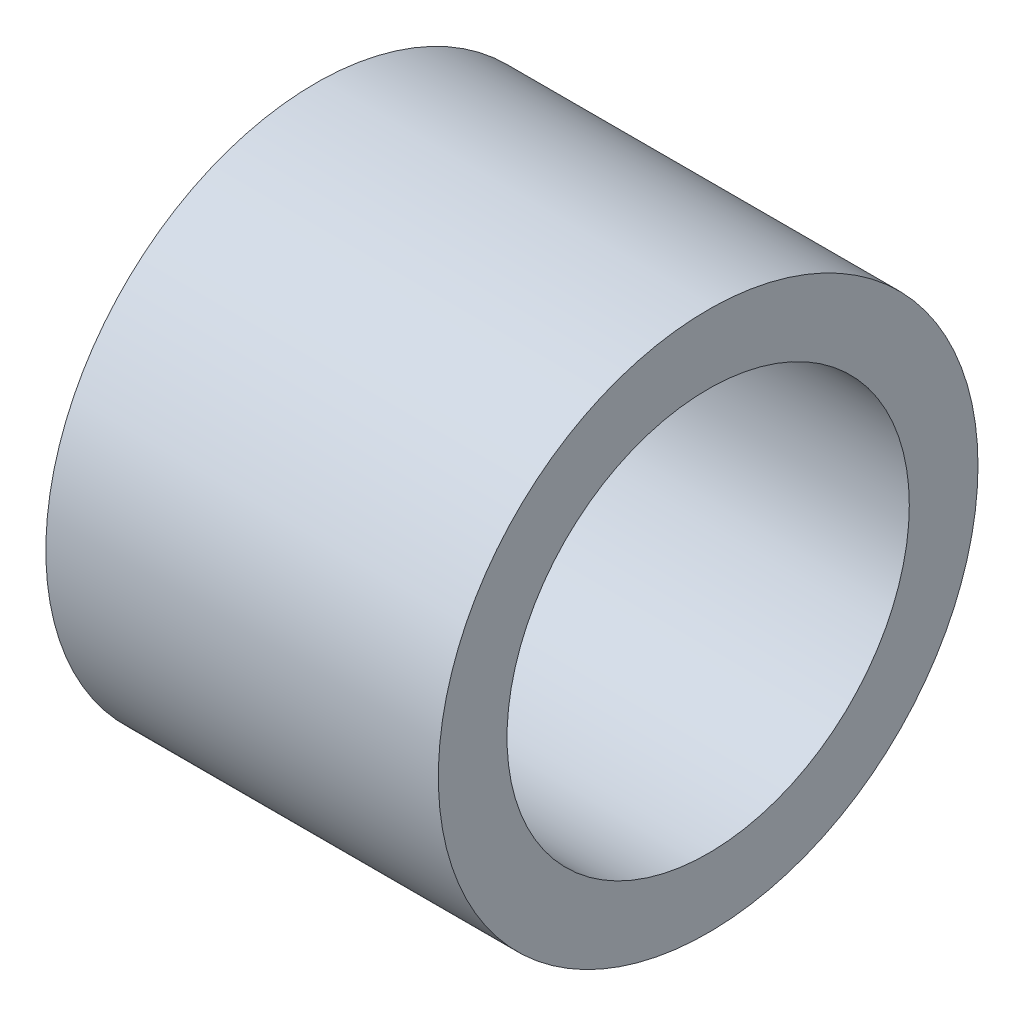
ISO-10303-21;
HEADER;
FILE_DESCRIPTION(('STEP AP214'),'2;1');
FILE_NAME('part.step','',(''),(''),'','','');
FILE_SCHEMA(('AUTOMOTIVE_DESIGN { 1 0 10303 214 1 1 1 1 }'));
ENDSEC;
DATA;
#1=APPLICATION_CONTEXT('core data for automotive mechanical design processes');
#2=APPLICATION_PROTOCOL_DEFINITION('international standard','automotive_design',2000,#1);
#3=PRODUCT_CONTEXT('',#1,'mechanical');
#4=PRODUCT('Part','Part','',(#3));
#5=PRODUCT_RELATED_PRODUCT_CATEGORY('part','',(#4));
#6=PRODUCT_DEFINITION_FORMATION('','',#4);
#7=PRODUCT_DEFINITION_CONTEXT('part definition',#1,'design');
#8=PRODUCT_DEFINITION('design','',#6,#7);
#9=PRODUCT_DEFINITION_SHAPE('','',#8);
#10=(LENGTH_UNIT() NAMED_UNIT(*) SI_UNIT(.MILLI.,.METRE.));
#11=(NAMED_UNIT(*) PLANE_ANGLE_UNIT() SI_UNIT($,.RADIAN.));
#12=(NAMED_UNIT(*) SI_UNIT($,.STERADIAN.) SOLID_ANGLE_UNIT());
#13=UNCERTAINTY_MEASURE_WITH_UNIT(LENGTH_MEASURE(1.E-05),#10,'distance_accuracy_value','');
#14=(GEOMETRIC_REPRESENTATION_CONTEXT(3) GLOBAL_UNCERTAINTY_ASSIGNED_CONTEXT((#13)) GLOBAL_UNIT_ASSIGNED_CONTEXT((#10,
#11,#12)) REPRESENTATION_CONTEXT('',''));
#15=CARTESIAN_POINT('',(0.,0.,0.));
#16=DIRECTION('',(0.,0.,1.));
#17=DIRECTION('',(1.,0.,0.));
#18=AXIS2_PLACEMENT_3D('',#15,#16,#17);
#19=CARTESIAN_POINT('',(8.,0.,0.));
#20=DIRECTION('',(1.,0.,0.));
#21=DIRECTION('',(0.,0.,-1.));
#22=AXIS2_PLACEMENT_3D('',#19,#20,#21);
#23=PLANE('',#22);
#24=CARTESIAN_POINT('',(8.,0.,0.));
#25=DIRECTION('',(1.,0.,0.));
#26=DIRECTION('',(0.,0.,-1.));
#27=AXIS2_PLACEMENT_3D('',#24,#25,#26);
#28=CIRCLE('',#27,5.5);
#29=CARTESIAN_POINT('',(8.,0.,-5.5));
#30=VERTEX_POINT('',#29);
#31=EDGE_CURVE('E10',#30,#30,#28,.T.);
#32=ORIENTED_EDGE('',*,*,#31,.T.);
#33=EDGE_LOOP('',(#32));
#34=FACE_BOUND('',#33,.T.);
#35=CARTESIAN_POINT('',(8.,0.,0.));
#36=DIRECTION('',(1.,0.,0.));
#37=DIRECTION('',(0.,0.,-1.));
#38=AXIS2_PLACEMENT_3D('',#35,#36,#37);
#39=CIRCLE('',#38,4.1);
#40=CARTESIAN_POINT('',(8.,0.,-4.1));
#41=VERTEX_POINT('',#40);
#42=EDGE_CURVE('E56',#41,#41,#39,.T.);
#43=ORIENTED_EDGE('',*,*,#42,.F.);
#44=EDGE_LOOP('',(#43));
#45=FACE_BOUND('',#44,.T.);
#46=ADVANCED_FACE('F43',(#34,#45),#23,.T.);
#47=CARTESIAN_POINT('',(0.,0.,0.));
#48=DIRECTION('',(1.,0.,0.));
#49=DIRECTION('',(0.,0.,-1.));
#50=AXIS2_PLACEMENT_3D('',#47,#48,#49);
#51=PLANE('',#50);
#52=CARTESIAN_POINT('',(0.,0.,0.));
#53=DIRECTION('',(1.,0.,0.));
#54=DIRECTION('',(0.,0.,-1.));
#55=AXIS2_PLACEMENT_3D('',#52,#53,#54);
#56=CIRCLE('',#55,5.5);
#57=CARTESIAN_POINT('',(0.,0.,-5.5));
#58=VERTEX_POINT('',#57);
#59=EDGE_CURVE('E47',#58,#58,#56,.T.);
#60=ORIENTED_EDGE('',*,*,#59,.F.);
#61=EDGE_LOOP('',(#60));
#62=FACE_BOUND('',#61,.T.);
#63=CARTESIAN_POINT('',(0.,0.,0.));
#64=DIRECTION('',(1.,0.,0.));
#65=DIRECTION('',(0.,0.,-1.));
#66=AXIS2_PLACEMENT_3D('',#63,#64,#65);
#67=CIRCLE('',#66,4.1);
#68=CARTESIAN_POINT('',(0.,0.,-4.1));
#69=VERTEX_POINT('',#68);
#70=EDGE_CURVE('E58',#69,#69,#67,.T.);
#71=ORIENTED_EDGE('',*,*,#70,.T.);
#72=EDGE_LOOP('',(#71));
#73=FACE_BOUND('',#72,.T.);
#74=ADVANCED_FACE('F70',(#62,#73),#51,.F.);
#75=CARTESIAN_POINT('',(8.,0.,0.));
#76=DIRECTION('',(-1.,0.,0.));
#77=DIRECTION('',(0.,0.,1.));
#78=AXIS2_PLACEMENT_3D('',#75,#76,#77);
#79=CYLINDRICAL_SURFACE('',#78,5.5);
#80=ORIENTED_EDGE('',*,*,#31,.F.);
#81=EDGE_LOOP('',(#80));
#82=FACE_BOUND('',#81,.T.);
#83=ORIENTED_EDGE('',*,*,#59,.T.);
#84=EDGE_LOOP('',(#83));
#85=FACE_BOUND('',#84,.T.);
#86=ADVANCED_FACE('F45',(#82,#85),#79,.T.);
#87=CARTESIAN_POINT('',(8.,0.,0.));
#88=DIRECTION('',(-1.,0.,0.));
#89=DIRECTION('',(0.,0.,1.));
#90=AXIS2_PLACEMENT_3D('',#87,#88,#89);
#91=CYLINDRICAL_SURFACE('',#90,4.1);
#92=ORIENTED_EDGE('',*,*,#42,.T.);
#93=EDGE_LOOP('',(#92));
#94=FACE_BOUND('',#93,.T.);
#95=ORIENTED_EDGE('',*,*,#70,.F.);
#96=EDGE_LOOP('',(#95));
#97=FACE_BOUND('',#96,.T.);
#98=ADVANCED_FACE('F66',(#94,#97),#91,.F.);
#99=CLOSED_SHELL('',(#46,#74,#86,#98));
#100=MANIFOLD_SOLID_BREP('B2',#99);
#101=ADVANCED_BREP_SHAPE_REPRESENTATION('',(#18,#100),#14);
#102=SHAPE_DEFINITION_REPRESENTATION(#9,#101);
ENDSEC;
END-ISO-10303-21;
